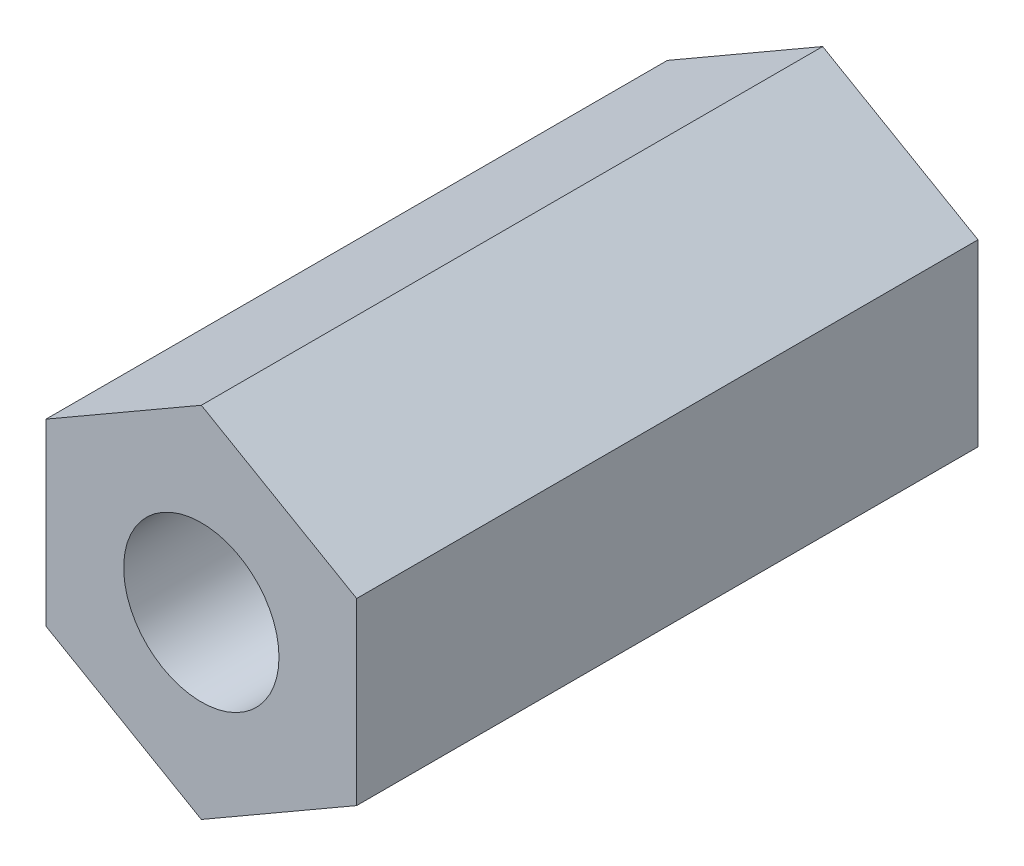
ISO-10303-21;
HEADER;
FILE_DESCRIPTION(('STEP AP214'),'2;1');
FILE_NAME('part.step','',(''),(''),'','','');
FILE_SCHEMA(('AUTOMOTIVE_DESIGN { 1 0 10303 214 1 1 1 1 }'));
ENDSEC;
DATA;
#1=APPLICATION_CONTEXT('core data for automotive mechanical design processes');
#2=APPLICATION_PROTOCOL_DEFINITION('international standard','automotive_design',2000,#1);
#3=PRODUCT_CONTEXT('',#1,'mechanical');
#4=PRODUCT('Part','Part','',(#3));
#5=PRODUCT_RELATED_PRODUCT_CATEGORY('part','',(#4));
#6=PRODUCT_DEFINITION_FORMATION('','',#4);
#7=PRODUCT_DEFINITION_CONTEXT('part definition',#1,'design');
#8=PRODUCT_DEFINITION('design','',#6,#7);
#9=PRODUCT_DEFINITION_SHAPE('','',#8);
#10=(LENGTH_UNIT() NAMED_UNIT(*) SI_UNIT(.MILLI.,.METRE.));
#11=(NAMED_UNIT(*) PLANE_ANGLE_UNIT() SI_UNIT($,.RADIAN.));
#12=(NAMED_UNIT(*) SI_UNIT($,.STERADIAN.) SOLID_ANGLE_UNIT());
#13=UNCERTAINTY_MEASURE_WITH_UNIT(LENGTH_MEASURE(1.E-05),#10,'distance_accuracy_value','');
#14=(GEOMETRIC_REPRESENTATION_CONTEXT(3) GLOBAL_UNCERTAINTY_ASSIGNED_CONTEXT((#13)) GLOBAL_UNIT_ASSIGNED_CONTEXT((#10,
#11,#12)) REPRESENTATION_CONTEXT('',''));
#15=CARTESIAN_POINT('',(0.,0.,0.));
#16=DIRECTION('',(0.,0.,1.));
#17=DIRECTION('',(1.,0.,0.));
#18=AXIS2_PLACEMENT_3D('',#15,#16,#17);
#19=CARTESIAN_POINT('',(0.,2.88675134594813,5.));
#20=DIRECTION('',(0.5,-0.866025403784439,0.));
#21=DIRECTION('',(0.866025403784439,0.5,0.));
#22=AXIS2_PLACEMENT_3D('',#19,#20,#21);
#23=PLANE('',#22);
#24=DIRECTION('',(0.,0.,-1.));
#25=VECTOR('',#24,1.);
#26=CARTESIAN_POINT('',(-2.5,1.44337567297406,5.));
#27=LINE('',#26,#25);
#28=CARTESIAN_POINT('',(-2.5,1.44337567297406,-5.));
#29=VERTEX_POINT('',#28);
#30=CARTESIAN_POINT('',(-2.5,1.44337567297406,5.));
#31=VERTEX_POINT('',#30);
#32=EDGE_CURVE('E83',#29,#31,#27,.F.);
#33=ORIENTED_EDGE('',*,*,#32,.T.);
#34=DIRECTION('',(-0.866025403784438,-0.5,0.));
#35=VECTOR('',#34,1.);
#36=CARTESIAN_POINT('',(0.,2.88675134594813,5.));
#37=LINE('',#36,#35);
#38=CARTESIAN_POINT('',(0.,2.88675134594813,5.));
#39=VERTEX_POINT('',#38);
#40=EDGE_CURVE('E79',#39,#31,#37,.T.);
#41=ORIENTED_EDGE('',*,*,#40,.F.);
#42=DIRECTION('',(0.,0.,1.));
#43=VECTOR('',#42,1.);
#44=CARTESIAN_POINT('',(0.,2.88675134594813,5.));
#45=LINE('',#44,#43);
#46=CARTESIAN_POINT('',(0.,2.88675134594813,-5.));
#47=VERTEX_POINT('',#46);
#48=EDGE_CURVE('E67',#39,#47,#45,.F.);
#49=ORIENTED_EDGE('',*,*,#48,.T.);
#50=DIRECTION('',(-0.866025403784438,-0.5,0.));
#51=VECTOR('',#50,1.);
#52=CARTESIAN_POINT('',(0.,2.88675134594813,-5.));
#53=LINE('',#52,#51);
#54=EDGE_CURVE('E116',#47,#29,#53,.T.);
#55=ORIENTED_EDGE('',*,*,#54,.T.);
#56=EDGE_LOOP('',(#33,#41,#49,#55));
#57=FACE_BOUND('',#56,.T.);
#58=ADVANCED_FACE('F16',(#57),#23,.F.);
#59=CARTESIAN_POINT('',(-2.5,1.44337567297406,5.));
#60=DIRECTION('',(1.,0.,0.));
#61=DIRECTION('',(0.,0.,-1.));
#62=AXIS2_PLACEMENT_3D('',#59,#60,#61);
#63=PLANE('',#62);
#64=DIRECTION('',(0.,0.,1.));
#65=VECTOR('',#64,1.);
#66=CARTESIAN_POINT('',(-2.5,-1.44337567297407,5.));
#67=LINE('',#66,#65);
#68=CARTESIAN_POINT('',(-2.5,-1.44337567297407,-5.));
#69=VERTEX_POINT('',#68);
#70=CARTESIAN_POINT('',(-2.5,-1.44337567297407,5.));
#71=VERTEX_POINT('',#70);
#72=EDGE_CURVE('E98',#69,#71,#67,.T.);
#73=ORIENTED_EDGE('',*,*,#72,.T.);
#74=DIRECTION('',(0.,1.,0.));
#75=VECTOR('',#74,1.);
#76=CARTESIAN_POINT('',(-2.5,2.88675134594813,5.));
#77=LINE('',#76,#75);
#78=EDGE_CURVE('E85',#31,#71,#77,.F.);
#79=ORIENTED_EDGE('',*,*,#78,.F.);
#80=ORIENTED_EDGE('',*,*,#32,.F.);
#81=DIRECTION('',(0.,1.,0.));
#82=VECTOR('',#81,1.);
#83=CARTESIAN_POINT('',(-2.5,2.88675134594813,-5.));
#84=LINE('',#83,#82);
#85=EDGE_CURVE('E106',#29,#69,#84,.F.);
#86=ORIENTED_EDGE('',*,*,#85,.T.);
#87=EDGE_LOOP('',(#73,#79,#80,#86));
#88=FACE_BOUND('',#87,.T.);
#89=ADVANCED_FACE('F104',(#88),#63,.F.);
#90=CARTESIAN_POINT('',(-2.5,-1.44337567297407,5.));
#91=DIRECTION('',(0.5,0.866025403784439,0.));
#92=DIRECTION('',(-0.866025403784439,0.5,0.));
#93=AXIS2_PLACEMENT_3D('',#90,#91,#92);
#94=PLANE('',#93);
#95=DIRECTION('',(0.,0.,1.));
#96=VECTOR('',#95,1.);
#97=CARTESIAN_POINT('',(0.,-2.88675134594813,5.));
#98=LINE('',#97,#96);
#99=CARTESIAN_POINT('',(0.,-2.88675134594813,-5.));
#100=VERTEX_POINT('',#99);
#101=CARTESIAN_POINT('',(0.,-2.88675134594813,5.));
#102=VERTEX_POINT('',#101);
#103=EDGE_CURVE('E95',#100,#102,#98,.T.);
#104=ORIENTED_EDGE('',*,*,#103,.T.);
#105=DIRECTION('',(0.866025403784439,-0.5,0.));
#106=VECTOR('',#105,1.);
#107=CARTESIAN_POINT('',(-2.5,-1.44337567297407,5.));
#108=LINE('',#107,#106);
#109=EDGE_CURVE('E87',#71,#102,#108,.T.);
#110=ORIENTED_EDGE('',*,*,#109,.F.);
#111=ORIENTED_EDGE('',*,*,#72,.F.);
#112=DIRECTION('',(0.866025403784439,-0.5,0.));
#113=VECTOR('',#112,1.);
#114=CARTESIAN_POINT('',(-2.5,-1.44337567297407,-5.));
#115=LINE('',#114,#113);
#116=EDGE_CURVE('E119',#69,#100,#115,.T.);
#117=ORIENTED_EDGE('',*,*,#116,.T.);
#118=EDGE_LOOP('',(#104,#110,#111,#117));
#119=FACE_BOUND('',#118,.T.);
#120=ADVANCED_FACE('F110',(#119),#94,.F.);
#121=CARTESIAN_POINT('',(0.,-2.88675134594813,5.));
#122=DIRECTION('',(-0.5,0.866025403784439,0.));
#123=DIRECTION('',(-0.866025403784439,-0.5,0.));
#124=AXIS2_PLACEMENT_3D('',#121,#122,#123);
#125=PLANE('',#124);
#126=DIRECTION('',(0.,0.,1.));
#127=VECTOR('',#126,1.);
#128=CARTESIAN_POINT('',(2.5,-1.44337567297406,5.));
#129=LINE('',#128,#127);
#130=CARTESIAN_POINT('',(2.5,-1.44337567297406,-5.));
#131=VERTEX_POINT('',#130);
#132=CARTESIAN_POINT('',(2.5,-1.44337567297406,5.));
#133=VERTEX_POINT('',#132);
#134=EDGE_CURVE('E92',#131,#133,#129,.T.);
#135=ORIENTED_EDGE('',*,*,#134,.T.);
#136=DIRECTION('',(0.866025403784439,0.5,0.));
#137=VECTOR('',#136,1.);
#138=CARTESIAN_POINT('',(0.,-2.88675134594813,5.));
#139=LINE('',#138,#137);
#140=EDGE_CURVE('E112',#102,#133,#139,.T.);
#141=ORIENTED_EDGE('',*,*,#140,.F.);
#142=ORIENTED_EDGE('',*,*,#103,.F.);
#143=DIRECTION('',(0.866025403784439,0.5,0.));
#144=VECTOR('',#143,1.);
#145=CARTESIAN_POINT('',(0.,-2.88675134594813,-5.));
#146=LINE('',#145,#144);
#147=EDGE_CURVE('E121',#100,#131,#146,.T.);
#148=ORIENTED_EDGE('',*,*,#147,.T.);
#149=EDGE_LOOP('',(#135,#141,#142,#148));
#150=FACE_BOUND('',#149,.T.);
#151=ADVANCED_FACE('F151',(#150),#125,.F.);
#152=CARTESIAN_POINT('',(2.5,-1.44337567297406,5.));
#153=DIRECTION('',(-1.,0.,0.));
#154=DIRECTION('',(0.,0.,1.));
#155=AXIS2_PLACEMENT_3D('',#152,#153,#154);
#156=PLANE('',#155);
#157=DIRECTION('',(0.,0.,1.));
#158=VECTOR('',#157,1.);
#159=CARTESIAN_POINT('',(2.5,1.44337567297406,5.));
#160=LINE('',#159,#158);
#161=CARTESIAN_POINT('',(2.5,1.44337567297406,-5.));
#162=VERTEX_POINT('',#161);
#163=CARTESIAN_POINT('',(2.5,1.44337567297406,5.));
#164=VERTEX_POINT('',#163);
#165=EDGE_CURVE('E32',#162,#164,#160,.T.);
#166=ORIENTED_EDGE('',*,*,#165,.T.);
#167=DIRECTION('',(0.,1.,0.));
#168=VECTOR('',#167,1.);
#169=CARTESIAN_POINT('',(2.5,2.88675134594813,5.));
#170=LINE('',#169,#168);
#171=EDGE_CURVE('E81',#133,#164,#170,.T.);
#172=ORIENTED_EDGE('',*,*,#171,.F.);
#173=ORIENTED_EDGE('',*,*,#134,.F.);
#174=DIRECTION('',(0.,1.,0.));
#175=VECTOR('',#174,1.);
#176=CARTESIAN_POINT('',(2.5,2.88675134594813,-5.));
#177=LINE('',#176,#175);
#178=EDGE_CURVE('E124',#131,#162,#177,.T.);
#179=ORIENTED_EDGE('',*,*,#178,.T.);
#180=EDGE_LOOP('',(#166,#172,#173,#179));
#181=FACE_BOUND('',#180,.T.);
#182=ADVANCED_FACE('F148',(#181),#156,.F.);
#183=CARTESIAN_POINT('',(2.5,1.44337567297406,5.));
#184=DIRECTION('',(-0.5,-0.866025403784439,0.));
#185=DIRECTION('',(0.866025403784439,-0.5,0.));
#186=AXIS2_PLACEMENT_3D('',#183,#184,#185);
#187=PLANE('',#186);
#188=ORIENTED_EDGE('',*,*,#48,.F.);
#189=DIRECTION('',(-0.866025403784439,0.5,0.));
#190=VECTOR('',#189,1.);
#191=CARTESIAN_POINT('',(2.5,1.44337567297406,5.));
#192=LINE('',#191,#190);
#193=EDGE_CURVE('E70',#164,#39,#192,.T.);
#194=ORIENTED_EDGE('',*,*,#193,.F.);
#195=ORIENTED_EDGE('',*,*,#165,.F.);
#196=DIRECTION('',(-0.866025403784439,0.5,0.));
#197=VECTOR('',#196,1.);
#198=CARTESIAN_POINT('',(2.5,1.44337567297406,-5.));
#199=LINE('',#198,#197);
#200=EDGE_CURVE('E71',#162,#47,#199,.T.);
#201=ORIENTED_EDGE('',*,*,#200,.T.);
#202=EDGE_LOOP('',(#188,#194,#195,#201));
#203=FACE_BOUND('',#202,.T.);
#204=ADVANCED_FACE('F69',(#203),#187,.F.);
#205=CARTESIAN_POINT('',(0.,2.88675134594813,5.));
#206=DIRECTION('',(0.,0.,1.));
#207=DIRECTION('',(1.,0.,0.));
#208=AXIS2_PLACEMENT_3D('',#205,#206,#207);
#209=PLANE('',#208);
#210=ORIENTED_EDGE('',*,*,#140,.T.);
#211=ORIENTED_EDGE('',*,*,#171,.T.);
#212=ORIENTED_EDGE('',*,*,#193,.T.);
#213=ORIENTED_EDGE('',*,*,#40,.T.);
#214=ORIENTED_EDGE('',*,*,#78,.T.);
#215=ORIENTED_EDGE('',*,*,#109,.T.);
#216=EDGE_LOOP('',(#210,#211,#212,#213,#214,#215));
#217=FACE_BOUND('',#216,.T.);
#218=CARTESIAN_POINT('',(0.,0.,5.));
#219=DIRECTION('',(0.,0.,1.));
#220=DIRECTION('',(1.,0.,0.));
#221=AXIS2_PLACEMENT_3D('',#218,#219,#220);
#222=CIRCLE('',#221,1.25);
#223=CARTESIAN_POINT('',(1.25,0.,5.));
#224=VERTEX_POINT('',#223);
#225=EDGE_CURVE('E19',#224,#224,#222,.F.);
#226=ORIENTED_EDGE('',*,*,#225,.T.);
#227=EDGE_LOOP('',(#226));
#228=FACE_BOUND('',#227,.T.);
#229=ADVANCED_FACE('F77',(#217,#228),#209,.T.);
#230=CARTESIAN_POINT('',(0.,2.88675134594813,-5.));
#231=DIRECTION('',(0.,0.,1.));
#232=DIRECTION('',(1.,0.,0.));
#233=AXIS2_PLACEMENT_3D('',#230,#231,#232);
#234=PLANE('',#233);
#235=ORIENTED_EDGE('',*,*,#178,.F.);
#236=ORIENTED_EDGE('',*,*,#147,.F.);
#237=ORIENTED_EDGE('',*,*,#116,.F.);
#238=ORIENTED_EDGE('',*,*,#85,.F.);
#239=ORIENTED_EDGE('',*,*,#54,.F.);
#240=ORIENTED_EDGE('',*,*,#200,.F.);
#241=EDGE_LOOP('',(#235,#236,#237,#238,#239,#240));
#242=FACE_BOUND('',#241,.T.);
#243=CARTESIAN_POINT('',(0.,0.,-5.));
#244=DIRECTION('',(0.,0.,1.));
#245=DIRECTION('',(1.,0.,0.));
#246=AXIS2_PLACEMENT_3D('',#243,#244,#245);
#247=CIRCLE('',#246,1.25);
#248=CARTESIAN_POINT('',(1.25,0.,-5.));
#249=VERTEX_POINT('',#248);
#250=EDGE_CURVE('E11',#249,#249,#247,.T.);
#251=ORIENTED_EDGE('',*,*,#250,.T.);
#252=EDGE_LOOP('',(#251));
#253=FACE_BOUND('',#252,.T.);
#254=ADVANCED_FACE('F132',(#242,#253),#234,.F.);
#255=CARTESIAN_POINT('',(0.,0.,5.));
#256=DIRECTION('',(0.,0.,1.));
#257=DIRECTION('',(1.,0.,0.));
#258=AXIS2_PLACEMENT_3D('',#255,#256,#257);
#259=CYLINDRICAL_SURFACE('',#258,1.25);
#260=ORIENTED_EDGE('',*,*,#225,.F.);
#261=EDGE_LOOP('',(#260));
#262=FACE_BOUND('',#261,.T.);
#263=ORIENTED_EDGE('',*,*,#250,.F.);
#264=EDGE_LOOP('',(#263));
#265=FACE_BOUND('',#264,.T.);
#266=ADVANCED_FACE('F129',(#262,#265),#259,.F.);
#267=CLOSED_SHELL('',(#58,#89,#120,#151,#182,#204,#229,#254,#266));
#268=MANIFOLD_SOLID_BREP('B1',#267);
#269=ADVANCED_BREP_SHAPE_REPRESENTATION('',(#18,#268),#14);
#270=SHAPE_DEFINITION_REPRESENTATION(#9,#269);
ENDSEC;
END-ISO-10303-21;
